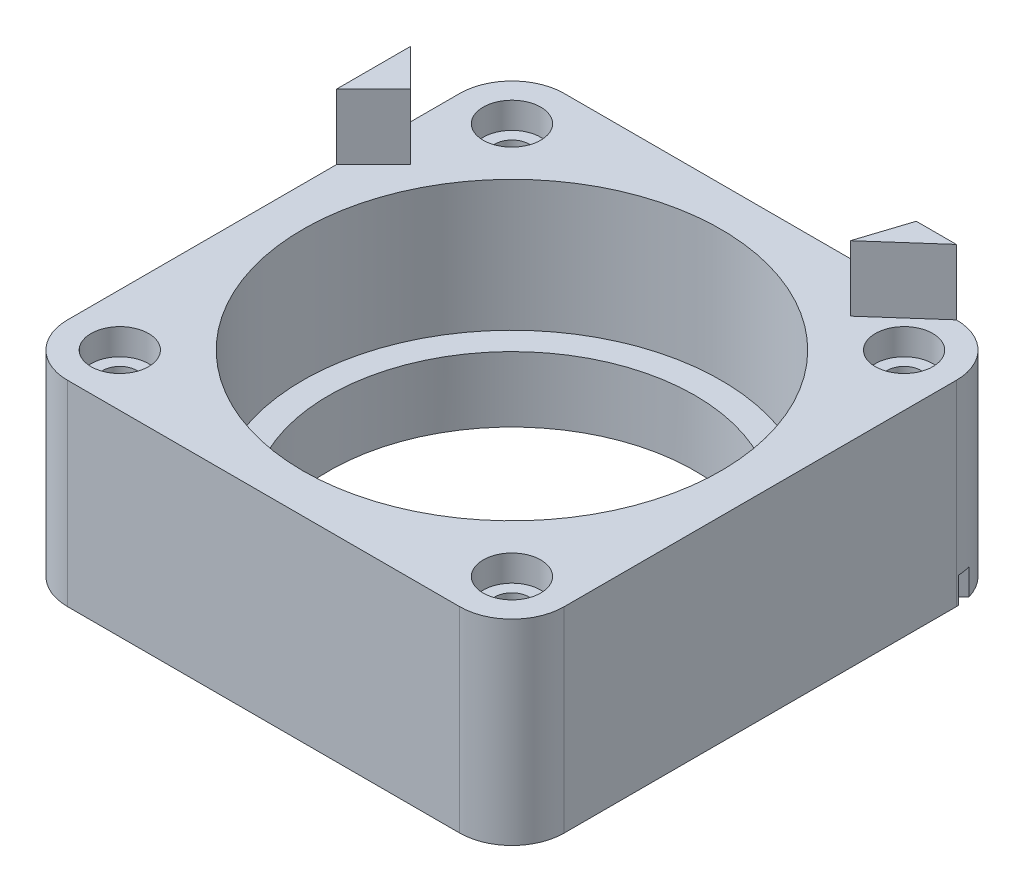
ISO-10303-21;
HEADER;
FILE_DESCRIPTION(('STEP AP214'),'2;1');
FILE_NAME('part.step','',(''),(''),'','','');
FILE_SCHEMA(('AUTOMOTIVE_DESIGN { 1 0 10303 214 1 1 1 1 }'));
ENDSEC;
DATA;
#1=APPLICATION_CONTEXT('core data for automotive mechanical design processes');
#2=APPLICATION_PROTOCOL_DEFINITION('international standard','automotive_design',2000,#1);
#3=PRODUCT_CONTEXT('',#1,'mechanical');
#4=PRODUCT('Part','Part','',(#3));
#5=PRODUCT_RELATED_PRODUCT_CATEGORY('part','',(#4));
#6=PRODUCT_DEFINITION_FORMATION('','',#4);
#7=PRODUCT_DEFINITION_CONTEXT('part definition',#1,'design');
#8=PRODUCT_DEFINITION('design','',#6,#7);
#9=PRODUCT_DEFINITION_SHAPE('','',#8);
#10=(LENGTH_UNIT() NAMED_UNIT(*) SI_UNIT(.MILLI.,.METRE.));
#11=(NAMED_UNIT(*) PLANE_ANGLE_UNIT() SI_UNIT($,.RADIAN.));
#12=(NAMED_UNIT(*) SI_UNIT($,.STERADIAN.) SOLID_ANGLE_UNIT());
#13=UNCERTAINTY_MEASURE_WITH_UNIT(LENGTH_MEASURE(1.E-05),#10,'distance_accuracy_value','');
#14=(GEOMETRIC_REPRESENTATION_CONTEXT(3) GLOBAL_UNCERTAINTY_ASSIGNED_CONTEXT((#13)) GLOBAL_UNIT_ASSIGNED_CONTEXT((#10,
#11,#12)) REPRESENTATION_CONTEXT('',''));
#15=CARTESIAN_POINT('',(0.,0.,0.));
#16=DIRECTION('',(0.,0.,1.));
#17=DIRECTION('',(1.,0.,0.));
#18=AXIS2_PLACEMENT_3D('',#15,#16,#17);
#19=CARTESIAN_POINT('',(0.,15.,0.));
#20=DIRECTION('',(0.,1.,0.));
#21=DIRECTION('',(0.,0.,1.));
#22=AXIS2_PLACEMENT_3D('',#19,#20,#21);
#23=PLANE('',#22);
#24=CARTESIAN_POINT('',(-15.,15.,-15.));
#25=DIRECTION('',(0.,1.,0.));
#26=DIRECTION('',(0.,0.,1.));
#27=AXIS2_PLACEMENT_3D('',#24,#25,#26);
#28=CIRCLE('',#27,2.2);
#29=CARTESIAN_POINT('',(-15.,15.,-12.8));
#30=VERTEX_POINT('',#29);
#31=EDGE_CURVE('E216',#30,#30,#28,.T.);
#32=ORIENTED_EDGE('',*,*,#31,.F.);
#33=EDGE_LOOP('',(#32));
#34=FACE_BOUND('',#33,.T.);
#35=CARTESIAN_POINT('',(15.,15.,-15.));
#36=DIRECTION('',(0.,1.,0.));
#37=DIRECTION('',(0.,0.,1.));
#38=AXIS2_PLACEMENT_3D('',#35,#36,#37);
#39=CIRCLE('',#38,2.2);
#40=CARTESIAN_POINT('',(15.,15.,-12.8));
#41=VERTEX_POINT('',#40);
#42=EDGE_CURVE('E228',#41,#41,#39,.T.);
#43=ORIENTED_EDGE('',*,*,#42,.F.);
#44=EDGE_LOOP('',(#43));
#45=FACE_BOUND('',#44,.T.);
#46=CARTESIAN_POINT('',(-15.,15.,15.));
#47=DIRECTION('',(0.,1.,0.));
#48=DIRECTION('',(0.,0.,1.));
#49=AXIS2_PLACEMENT_3D('',#46,#47,#48);
#50=CIRCLE('',#49,2.2);
#51=CARTESIAN_POINT('',(-15.,15.,17.2));
#52=VERTEX_POINT('',#51);
#53=EDGE_CURVE('E240',#52,#52,#50,.T.);
#54=ORIENTED_EDGE('',*,*,#53,.F.);
#55=EDGE_LOOP('',(#54));
#56=FACE_BOUND('',#55,.T.);
#57=CARTESIAN_POINT('',(15.,15.,15.));
#58=DIRECTION('',(0.,1.,0.));
#59=DIRECTION('',(0.,0.,1.));
#60=AXIS2_PLACEMENT_3D('',#57,#58,#59);
#61=CIRCLE('',#60,2.2);
#62=CARTESIAN_POINT('',(15.,15.,17.2));
#63=VERTEX_POINT('',#62);
#64=EDGE_CURVE('E252',#63,#63,#61,.T.);
#65=ORIENTED_EDGE('',*,*,#64,.F.);
#66=EDGE_LOOP('',(#65));
#67=FACE_BOUND('',#66,.T.);
#68=CARTESIAN_POINT('',(0.,15.,0.));
#69=DIRECTION('',(0.,1.,0.));
#70=DIRECTION('',(0.,0.,1.));
#71=AXIS2_PLACEMENT_3D('',#68,#69,#70);
#72=CIRCLE('',#71,16.);
#73=CARTESIAN_POINT('',(0.,15.,16.));
#74=VERTEX_POINT('',#73);
#75=EDGE_CURVE('E272',#74,#74,#72,.T.);
#76=ORIENTED_EDGE('',*,*,#75,.F.);
#77=EDGE_LOOP('',(#76));
#78=FACE_BOUND('',#77,.T.);
#79=DIRECTION('',(0.748815360939308,0.,-0.662778662315961));
#80=VECTOR('',#79,1.);
#81=CARTESIAN_POINT('',(10.7004792307012,15.,-15.194481613597));
#82=LINE('',#81,#80);
#83=CARTESIAN_POINT('',(10.7004792307012,15.,-15.194481613597));
#84=VERTEX_POINT('',#83);
#85=CARTESIAN_POINT('',(15.,15.,-19.));
#86=VERTEX_POINT('',#85);
#87=EDGE_CURVE('E167',#84,#86,#82,.T.);
#88=ORIENTED_EDGE('',*,*,#87,.F.);
#89=DIRECTION('',(-0.308020881064552,0.,0.951379596600756));
#90=VECTOR('',#89,1.);
#91=CARTESIAN_POINT('',(11.9325627549594,15.,-19.));
#92=LINE('',#91,#90);
#93=CARTESIAN_POINT('',(11.9325627549594,15.,-19.));
#94=VERTEX_POINT('',#93);
#95=EDGE_CURVE('E392',#94,#84,#92,.T.);
#96=ORIENTED_EDGE('',*,*,#95,.F.);
#97=DIRECTION('',(-1.,0.,0.));
#98=VECTOR('',#97,1.);
#99=CARTESIAN_POINT('',(19.,15.,-19.));
#100=LINE('',#99,#98);
#101=CARTESIAN_POINT('',(-15.,15.,-19.));
#102=VERTEX_POINT('',#101);
#103=EDGE_CURVE('E173',#94,#102,#100,.T.);
#104=ORIENTED_EDGE('',*,*,#103,.T.);
#105=CARTESIAN_POINT('',(-15.,15.,-15.));
#106=DIRECTION('',(0.,1.,0.));
#107=DIRECTION('',(0.,0.,1.));
#108=AXIS2_PLACEMENT_3D('',#105,#106,#107);
#109=CIRCLE('',#108,4.);
#110=CARTESIAN_POINT('',(-19.,15.,-15.));
#111=VERTEX_POINT('',#110);
#112=EDGE_CURVE('E321',#102,#111,#109,.T.);
#113=ORIENTED_EDGE('',*,*,#112,.T.);
#114=DIRECTION('',(0.,0.,1.));
#115=VECTOR('',#114,1.);
#116=CARTESIAN_POINT('',(-19.,15.,-19.));
#117=LINE('',#116,#115);
#118=CARTESIAN_POINT('',(-19.,15.,-11.2218254069478));
#119=VERTEX_POINT('',#118);
#120=EDGE_CURVE('E281',#111,#119,#117,.T.);
#121=ORIENTED_EDGE('',*,*,#120,.T.);
#122=DIRECTION('',(-0.707106781186551,0.,-0.707106781186545));
#123=VECTOR('',#122,1.);
#124=CARTESIAN_POINT('',(-19.,15.,-11.2218254069478));
#125=LINE('',#124,#123);
#126=CARTESIAN_POINT('',(-16.1715728752538,15.,-8.39339828220164));
#127=VERTEX_POINT('',#126);
#128=EDGE_CURVE('E175',#127,#119,#125,.T.);
#129=ORIENTED_EDGE('',*,*,#128,.F.);
#130=DIRECTION('',(0.707106781186544,0.,-0.707106781186551));
#131=VECTOR('',#130,1.);
#132=CARTESIAN_POINT('',(-16.1715728752538,15.,-8.39339828220164));
#133=LINE('',#132,#131);
#134=CARTESIAN_POINT('',(-19.,15.,-5.56497115745542));
#135=VERTEX_POINT('',#134);
#136=EDGE_CURVE('E55',#135,#127,#133,.T.);
#137=ORIENTED_EDGE('',*,*,#136,.F.);
#138=CARTESIAN_POINT('',(-19.,15.,15.));
#139=VERTEX_POINT('',#138);
#140=EDGE_CURVE('E280',#135,#139,#117,.T.);
#141=ORIENTED_EDGE('',*,*,#140,.T.);
#142=CARTESIAN_POINT('',(-15.,15.,15.));
#143=DIRECTION('',(0.,1.,0.));
#144=DIRECTION('',(0.,0.,1.));
#145=AXIS2_PLACEMENT_3D('',#142,#143,#144);
#146=CIRCLE('',#145,4.);
#147=CARTESIAN_POINT('',(-15.,15.,19.));
#148=VERTEX_POINT('',#147);
#149=EDGE_CURVE('E325',#139,#148,#146,.T.);
#150=ORIENTED_EDGE('',*,*,#149,.T.);
#151=DIRECTION('',(1.,0.,0.));
#152=VECTOR('',#151,1.);
#153=CARTESIAN_POINT('',(-19.,15.,19.));
#154=LINE('',#153,#152);
#155=CARTESIAN_POINT('',(15.,15.,19.));
#156=VERTEX_POINT('',#155);
#157=EDGE_CURVE('E283',#148,#156,#154,.T.);
#158=ORIENTED_EDGE('',*,*,#157,.T.);
#159=CARTESIAN_POINT('',(15.,15.,15.));
#160=DIRECTION('',(0.,1.,0.));
#161=DIRECTION('',(0.,0.,1.));
#162=AXIS2_PLACEMENT_3D('',#159,#160,#161);
#163=CIRCLE('',#162,4.);
#164=CARTESIAN_POINT('',(19.,15.,15.));
#165=VERTEX_POINT('',#164);
#166=EDGE_CURVE('E323',#156,#165,#163,.T.);
#167=ORIENTED_EDGE('',*,*,#166,.T.);
#168=DIRECTION('',(0.,0.,-1.));
#169=VECTOR('',#168,1.);
#170=CARTESIAN_POINT('',(19.,15.,19.));
#171=LINE('',#170,#169);
#172=CARTESIAN_POINT('',(19.,15.,-15.));
#173=VERTEX_POINT('',#172);
#174=EDGE_CURVE('E275',#165,#173,#171,.T.);
#175=ORIENTED_EDGE('',*,*,#174,.T.);
#176=CARTESIAN_POINT('',(15.,15.,-15.));
#177=DIRECTION('',(0.,1.,0.));
#178=DIRECTION('',(0.,0.,1.));
#179=AXIS2_PLACEMENT_3D('',#176,#177,#178);
#180=CIRCLE('',#179,4.);
#181=EDGE_CURVE('E318',#173,#86,#180,.T.);
#182=ORIENTED_EDGE('',*,*,#181,.T.);
#183=EDGE_LOOP('',(#88,#96,#104,#113,#121,#129,#137,#141,#150,#158,#167,#175,#182));
#184=FACE_BOUND('',#183,.T.);
#185=ADVANCED_FACE('F32',(#34,#45,#56,#67,#78,#184),#23,.T.);
#186=CARTESIAN_POINT('',(19.,15.,19.));
#187=DIRECTION('',(-1.,0.,0.));
#188=DIRECTION('',(0.,0.,1.));
#189=AXIS2_PLACEMENT_3D('',#186,#187,#188);
#190=PLANE('',#189);
#191=ORIENTED_EDGE('',*,*,#174,.F.);
#192=DIRECTION('',(0.,-1.,0.));
#193=VECTOR('',#192,1.);
#194=CARTESIAN_POINT('',(19.,15.,15.));
#195=LINE('',#194,#193);
#196=CARTESIAN_POINT('',(19.,0.,15.));
#197=VERTEX_POINT('',#196);
#198=EDGE_CURVE('E329',#165,#197,#195,.T.);
#199=ORIENTED_EDGE('',*,*,#198,.T.);
#200=DIRECTION('',(0.,0.,-1.));
#201=VECTOR('',#200,1.);
#202=CARTESIAN_POINT('',(19.,0.,19.));
#203=LINE('',#202,#201);
#204=CARTESIAN_POINT('',(19.,0.,-15.));
#205=VERTEX_POINT('',#204);
#206=EDGE_CURVE('E271',#197,#205,#203,.T.);
#207=ORIENTED_EDGE('',*,*,#206,.T.);
#208=DIRECTION('',(0.,-1.,0.));
#209=VECTOR('',#208,1.);
#210=CARTESIAN_POINT('',(19.,15.,-15.));
#211=LINE('',#210,#209);
#212=EDGE_CURVE('E327',#205,#173,#211,.F.);
#213=ORIENTED_EDGE('',*,*,#212,.T.);
#214=EDGE_LOOP('',(#191,#199,#207,#213));
#215=FACE_BOUND('',#214,.T.);
#216=ADVANCED_FACE('F368',(#215),#190,.F.);
#217=CARTESIAN_POINT('',(19.,15.,-19.));
#218=DIRECTION('',(0.,0.,1.));
#219=DIRECTION('',(1.,0.,0.));
#220=AXIS2_PLACEMENT_3D('',#217,#218,#219);
#221=PLANE('',#220);
#222=DIRECTION('',(-1.,0.,0.));
#223=VECTOR('',#222,1.);
#224=CARTESIAN_POINT('',(19.,0.,-19.));
#225=LINE('',#224,#223);
#226=CARTESIAN_POINT('',(15.,0.,-19.));
#227=VERTEX_POINT('',#226);
#228=CARTESIAN_POINT('',(-15.,0.,-19.));
#229=VERTEX_POINT('',#228);
#230=EDGE_CURVE('E289',#227,#229,#225,.T.);
#231=ORIENTED_EDGE('',*,*,#230,.T.);
#232=DIRECTION('',(0.,-1.,0.));
#233=VECTOR('',#232,1.);
#234=CARTESIAN_POINT('',(-15.,15.,-19.));
#235=LINE('',#234,#233);
#236=EDGE_CURVE('E335',#229,#102,#235,.F.);
#237=ORIENTED_EDGE('',*,*,#236,.T.);
#238=ORIENTED_EDGE('',*,*,#103,.F.);
#239=DIRECTION('',(0.,-1.,0.));
#240=VECTOR('',#239,1.);
#241=CARTESIAN_POINT('',(11.9325627549594,20.,-19.));
#242=LINE('',#241,#240);
#243=CARTESIAN_POINT('',(11.9325627549594,20.,-19.));
#244=VERTEX_POINT('',#243);
#245=EDGE_CURVE('E156',#244,#94,#242,.T.);
#246=ORIENTED_EDGE('',*,*,#245,.F.);
#247=DIRECTION('',(-1.,0.,0.));
#248=VECTOR('',#247,1.);
#249=CARTESIAN_POINT('',(15.,20.,-19.));
#250=LINE('',#249,#248);
#251=CARTESIAN_POINT('',(15.,20.,-19.));
#252=VERTEX_POINT('',#251);
#253=EDGE_CURVE('E160',#252,#244,#250,.T.);
#254=ORIENTED_EDGE('',*,*,#253,.F.);
#255=DIRECTION('',(0.,-1.,0.));
#256=VECTOR('',#255,1.);
#257=CARTESIAN_POINT('',(15.,20.,-19.));
#258=LINE('',#257,#256);
#259=EDGE_CURVE('E177',#252,#86,#258,.T.);
#260=ORIENTED_EDGE('',*,*,#259,.T.);
#261=DIRECTION('',(0.,-1.,0.));
#262=VECTOR('',#261,1.);
#263=CARTESIAN_POINT('',(15.,15.,-19.));
#264=LINE('',#263,#262);
#265=EDGE_CURVE('E332',#86,#227,#264,.T.);
#266=ORIENTED_EDGE('',*,*,#265,.T.);
#267=EDGE_LOOP('',(#231,#237,#238,#246,#254,#260,#266));
#268=FACE_BOUND('',#267,.T.);
#269=ADVANCED_FACE('F171',(#268),#221,.F.);
#270=CARTESIAN_POINT('',(-19.,15.,-19.));
#271=DIRECTION('',(1.,0.,0.));
#272=DIRECTION('',(0.,0.,-1.));
#273=AXIS2_PLACEMENT_3D('',#270,#271,#272);
#274=PLANE('',#273);
#275=DIRECTION('',(0.,0.,1.));
#276=VECTOR('',#275,1.);
#277=CARTESIAN_POINT('',(-19.,0.,-19.));
#278=LINE('',#277,#276);
#279=CARTESIAN_POINT('',(-19.,0.,-15.));
#280=VERTEX_POINT('',#279);
#281=CARTESIAN_POINT('',(-19.,0.,15.));
#282=VERTEX_POINT('',#281);
#283=EDGE_CURVE('E291',#280,#282,#278,.T.);
#284=ORIENTED_EDGE('',*,*,#283,.T.);
#285=DIRECTION('',(0.,-1.,0.));
#286=VECTOR('',#285,1.);
#287=CARTESIAN_POINT('',(-19.,15.,15.));
#288=LINE('',#287,#286);
#289=EDGE_CURVE('E315',#282,#139,#288,.F.);
#290=ORIENTED_EDGE('',*,*,#289,.T.);
#291=ORIENTED_EDGE('',*,*,#140,.F.);
#292=DIRECTION('',(0.,-1.,0.));
#293=VECTOR('',#292,1.);
#294=CARTESIAN_POINT('',(-19.,20.,-5.56497115745541));
#295=LINE('',#294,#293);
#296=CARTESIAN_POINT('',(-19.,20.,-5.56497115745541));
#297=VERTEX_POINT('',#296);
#298=EDGE_CURVE('E196',#297,#135,#295,.T.);
#299=ORIENTED_EDGE('',*,*,#298,.F.);
#300=DIRECTION('',(0.,0.,1.));
#301=VECTOR('',#300,1.);
#302=CARTESIAN_POINT('',(-19.,20.,-5.56497115745541));
#303=LINE('',#302,#301);
#304=CARTESIAN_POINT('',(-19.,20.,-11.2218254069478));
#305=VERTEX_POINT('',#304);
#306=EDGE_CURVE('E181',#305,#297,#303,.T.);
#307=ORIENTED_EDGE('',*,*,#306,.F.);
#308=DIRECTION('',(0.,-1.,0.));
#309=VECTOR('',#308,1.);
#310=CARTESIAN_POINT('',(-19.,20.,-11.2218254069478));
#311=LINE('',#310,#309);
#312=EDGE_CURVE('E187',#305,#119,#311,.T.);
#313=ORIENTED_EDGE('',*,*,#312,.T.);
#314=ORIENTED_EDGE('',*,*,#120,.F.);
#315=DIRECTION('',(0.,-1.,0.));
#316=VECTOR('',#315,1.);
#317=CARTESIAN_POINT('',(-19.,15.,-15.));
#318=LINE('',#317,#316);
#319=EDGE_CURVE('E312',#111,#280,#318,.T.);
#320=ORIENTED_EDGE('',*,*,#319,.T.);
#321=EDGE_LOOP('',(#284,#290,#291,#299,#307,#313,#314,#320));
#322=FACE_BOUND('',#321,.T.);
#323=ADVANCED_FACE('F386',(#322),#274,.F.);
#324=CARTESIAN_POINT('',(-19.,15.,19.));
#325=DIRECTION('',(0.,0.,-1.));
#326=DIRECTION('',(-1.,0.,0.));
#327=AXIS2_PLACEMENT_3D('',#324,#325,#326);
#328=PLANE('',#327);
#329=ORIENTED_EDGE('',*,*,#157,.F.);
#330=DIRECTION('',(0.,-1.,0.));
#331=VECTOR('',#330,1.);
#332=CARTESIAN_POINT('',(-15.,15.,19.));
#333=LINE('',#332,#331);
#334=CARTESIAN_POINT('',(-15.,0.,19.));
#335=VERTEX_POINT('',#334);
#336=EDGE_CURVE('E299',#148,#335,#333,.T.);
#337=ORIENTED_EDGE('',*,*,#336,.T.);
#338=DIRECTION('',(1.,0.,0.));
#339=VECTOR('',#338,1.);
#340=CARTESIAN_POINT('',(-19.,0.,19.));
#341=LINE('',#340,#339);
#342=CARTESIAN_POINT('',(15.,0.,19.));
#343=VERTEX_POINT('',#342);
#344=EDGE_CURVE('E278',#335,#343,#341,.T.);
#345=ORIENTED_EDGE('',*,*,#344,.T.);
#346=DIRECTION('',(0.,-1.,0.));
#347=VECTOR('',#346,1.);
#348=CARTESIAN_POINT('',(15.,15.,19.));
#349=LINE('',#348,#347);
#350=EDGE_CURVE('E286',#343,#156,#349,.F.);
#351=ORIENTED_EDGE('',*,*,#350,.T.);
#352=EDGE_LOOP('',(#329,#337,#345,#351));
#353=FACE_BOUND('',#352,.T.);
#354=ADVANCED_FACE('F376',(#353),#328,.F.);
#355=CARTESIAN_POINT('',(0.,0.,0.));
#356=DIRECTION('',(0.,1.,0.));
#357=DIRECTION('',(0.,0.,1.));
#358=AXIS2_PLACEMENT_3D('',#355,#356,#357);
#359=PLANE('',#358);
#360=CARTESIAN_POINT('',(-15.,0.,-15.));
#361=DIRECTION('',(0.,1.,0.));
#362=DIRECTION('',(0.,0.,1.));
#363=AXIS2_PLACEMENT_3D('',#360,#361,#362);
#364=CIRCLE('',#363,1.3);
#365=CARTESIAN_POINT('',(-15.,0.,-13.7));
#366=VERTEX_POINT('',#365);
#367=EDGE_CURVE('E225',#366,#366,#364,.T.);
#368=ORIENTED_EDGE('',*,*,#367,.T.);
#369=EDGE_LOOP('',(#368));
#370=FACE_BOUND('',#369,.T.);
#371=CARTESIAN_POINT('',(15.,0.,-15.));
#372=DIRECTION('',(0.,1.,0.));
#373=DIRECTION('',(0.,0.,1.));
#374=AXIS2_PLACEMENT_3D('',#371,#372,#373);
#375=CIRCLE('',#374,1.3);
#376=CARTESIAN_POINT('',(15.,0.,-13.7));
#377=VERTEX_POINT('',#376);
#378=EDGE_CURVE('E237',#377,#377,#375,.T.);
#379=ORIENTED_EDGE('',*,*,#378,.T.);
#380=EDGE_LOOP('',(#379));
#381=FACE_BOUND('',#380,.T.);
#382=CARTESIAN_POINT('',(-15.,0.,15.));
#383=DIRECTION('',(0.,1.,0.));
#384=DIRECTION('',(0.,0.,1.));
#385=AXIS2_PLACEMENT_3D('',#382,#383,#384);
#386=CIRCLE('',#385,1.3);
#387=CARTESIAN_POINT('',(-15.,0.,16.3));
#388=VERTEX_POINT('',#387);
#389=EDGE_CURVE('E249',#388,#388,#386,.T.);
#390=ORIENTED_EDGE('',*,*,#389,.T.);
#391=EDGE_LOOP('',(#390));
#392=FACE_BOUND('',#391,.T.);
#393=CARTESIAN_POINT('',(15.,0.,15.));
#394=DIRECTION('',(0.,1.,0.));
#395=DIRECTION('',(0.,0.,1.));
#396=AXIS2_PLACEMENT_3D('',#393,#394,#395);
#397=CIRCLE('',#396,1.3);
#398=CARTESIAN_POINT('',(15.,0.,16.3));
#399=VERTEX_POINT('',#398);
#400=EDGE_CURVE('E261',#399,#399,#397,.T.);
#401=ORIENTED_EDGE('',*,*,#400,.T.);
#402=EDGE_LOOP('',(#401));
#403=FACE_BOUND('',#402,.T.);
#404=CARTESIAN_POINT('',(0.,0.,0.));
#405=DIRECTION('',(0.,1.,0.));
#406=DIRECTION('',(0.,0.,1.));
#407=AXIS2_PLACEMENT_3D('',#404,#405,#406);
#408=CIRCLE('',#407,14.);
#409=CARTESIAN_POINT('',(11.1826366805141,0.,-8.42310138082289));
#410=VERTEX_POINT('',#409);
#411=CARTESIAN_POINT('',(11.6498013210211,0.,-7.76415669475661));
#412=VERTEX_POINT('',#411);
#413=EDGE_CURVE('E264',#410,#412,#408,.T.);
#414=ORIENTED_EDGE('',*,*,#413,.T.);
#415=DIRECTION('',(-0.705141787682873,0.,0.709066329241068));
#416=VECTOR('',#415,1.);
#417=CARTESIAN_POINT('',(0.481017186760843,0.,3.46678849456391));
#418=LINE('',#417,#416);
#419=CARTESIAN_POINT('',(18.9970978092417,0.,-15.1523453424152));
#420=VERTEX_POINT('',#419);
#421=EDGE_CURVE('E199',#420,#412,#418,.T.);
#422=ORIENTED_EDGE('',*,*,#421,.F.);
#423=CARTESIAN_POINT('',(15.,0.,-15.));
#424=DIRECTION('',(0.,1.,0.));
#425=DIRECTION('',(0.,0.,1.));
#426=AXIS2_PLACEMENT_3D('',#423,#424,#425);
#427=CIRCLE('',#426,4.);
#428=EDGE_CURVE('E302',#420,#205,#427,.F.);
#429=ORIENTED_EDGE('',*,*,#428,.T.);
#430=ORIENTED_EDGE('',*,*,#206,.F.);
#431=CARTESIAN_POINT('',(15.,0.,15.));
#432=DIRECTION('',(0.,1.,0.));
#433=DIRECTION('',(0.,0.,1.));
#434=AXIS2_PLACEMENT_3D('',#431,#432,#433);
#435=CIRCLE('',#434,4.);
#436=EDGE_CURVE('E308',#197,#343,#435,.F.);
#437=ORIENTED_EDGE('',*,*,#436,.T.);
#438=ORIENTED_EDGE('',*,*,#344,.F.);
#439=CARTESIAN_POINT('',(-15.,0.,15.));
#440=DIRECTION('',(0.,1.,0.));
#441=DIRECTION('',(0.,0.,1.));
#442=AXIS2_PLACEMENT_3D('',#439,#440,#441);
#443=CIRCLE('',#442,4.);
#444=EDGE_CURVE('E310',#335,#282,#443,.F.);
#445=ORIENTED_EDGE('',*,*,#444,.T.);
#446=ORIENTED_EDGE('',*,*,#283,.F.);
#447=CARTESIAN_POINT('',(-15.,0.,-15.));
#448=DIRECTION('',(0.,1.,0.));
#449=DIRECTION('',(0.,0.,1.));
#450=AXIS2_PLACEMENT_3D('',#447,#448,#449);
#451=CIRCLE('',#450,4.);
#452=EDGE_CURVE('E306',#280,#229,#451,.F.);
#453=ORIENTED_EDGE('',*,*,#452,.T.);
#454=ORIENTED_EDGE('',*,*,#230,.F.);
#455=CARTESIAN_POINT('',(18.8393041891464,0.,-16.1223828861858));
#456=VERTEX_POINT('',#455);
#457=EDGE_CURVE('E303',#227,#456,#427,.F.);
#458=ORIENTED_EDGE('',*,*,#457,.T.);
#459=DIRECTION('',(0.705141787682873,0.,-0.709066329241068));
#460=VECTOR('',#459,1.);
#461=CARTESIAN_POINT('',(19.,0.,-16.2839730666526));
#462=LINE('',#461,#460);
#463=EDGE_CURVE('E204',#410,#456,#462,.T.);
#464=ORIENTED_EDGE('',*,*,#463,.F.);
#465=EDGE_LOOP('',(#414,#422,#429,#430,#437,#438,#445,#446,#453,#454,#458,#464));
#466=FACE_BOUND('',#465,.T.);
#467=ADVANCED_FACE('F359',(#370,#381,#392,#403,#466),#359,.F.);
#468=CARTESIAN_POINT('',(0.,5.,0.));
#469=DIRECTION('',(0.,1.,0.));
#470=DIRECTION('',(0.,0.,1.));
#471=AXIS2_PLACEMENT_3D('',#468,#469,#470);
#472=CYLINDRICAL_SURFACE('',#471,16.);
#473=CARTESIAN_POINT('',(0.,5.,0.));
#474=DIRECTION('',(0.,1.,0.));
#475=DIRECTION('',(0.,0.,1.));
#476=AXIS2_PLACEMENT_3D('',#473,#474,#475);
#477=CIRCLE('',#476,16.);
#478=CARTESIAN_POINT('',(0.,5.,16.));
#479=VERTEX_POINT('',#478);
#480=EDGE_CURVE('E268',#479,#479,#477,.T.);
#481=ORIENTED_EDGE('',*,*,#480,.F.);
#482=EDGE_LOOP('',(#481));
#483=FACE_BOUND('',#482,.T.);
#484=ORIENTED_EDGE('',*,*,#75,.T.);
#485=EDGE_LOOP('',(#484));
#486=FACE_BOUND('',#485,.T.);
#487=ADVANCED_FACE('F417',(#483,#486),#472,.F.);
#488=CARTESIAN_POINT('',(0.,5.,0.));
#489=DIRECTION('',(0.,1.,0.));
#490=DIRECTION('',(0.,0.,1.));
#491=AXIS2_PLACEMENT_3D('',#488,#489,#490);
#492=PLANE('',#491);
#493=CARTESIAN_POINT('',(0.,5.,0.));
#494=DIRECTION('',(0.,1.,0.));
#495=DIRECTION('',(0.,0.,1.));
#496=AXIS2_PLACEMENT_3D('',#493,#494,#495);
#497=CIRCLE('',#496,14.);
#498=CARTESIAN_POINT('',(0.,5.,14.));
#499=VERTEX_POINT('',#498);
#500=EDGE_CURVE('E267',#499,#499,#497,.T.);
#501=ORIENTED_EDGE('',*,*,#500,.F.);
#502=EDGE_LOOP('',(#501));
#503=FACE_BOUND('',#502,.T.);
#504=ORIENTED_EDGE('',*,*,#480,.T.);
#505=EDGE_LOOP('',(#504));
#506=FACE_BOUND('',#505,.T.);
#507=ADVANCED_FACE('F453',(#503,#506),#492,.T.);
#508=CARTESIAN_POINT('',(0.,0.,0.));
#509=DIRECTION('',(0.,1.,0.));
#510=DIRECTION('',(0.,0.,1.));
#511=AXIS2_PLACEMENT_3D('',#508,#509,#510);
#512=CYLINDRICAL_SURFACE('',#511,14.);
#513=ORIENTED_EDGE('',*,*,#500,.T.);
#514=EDGE_LOOP('',(#513));
#515=FACE_BOUND('',#514,.T.);
#516=CARTESIAN_POINT('',(0.,2.,0.));
#517=DIRECTION('',(0.,-1.,0.));
#518=DIRECTION('',(0.,0.,-1.));
#519=AXIS2_PLACEMENT_3D('',#516,#517,#518);
#520=CIRCLE('',#519,14.);
#521=CARTESIAN_POINT('',(11.6498013210211,2.,-7.76415669475661));
#522=VERTEX_POINT('',#521);
#523=CARTESIAN_POINT('',(11.1826366805141,2.,-8.42310138082289));
#524=VERTEX_POINT('',#523);
#525=EDGE_CURVE('E206',#522,#524,#520,.F.);
#526=ORIENTED_EDGE('',*,*,#525,.F.);
#527=DIRECTION('',(0.,1.,0.));
#528=VECTOR('',#527,1.);
#529=CARTESIAN_POINT('',(11.6498013210211,0.,-7.76415669475661));
#530=LINE('',#529,#528);
#531=EDGE_CURVE('E213',#522,#412,#530,.F.);
#532=ORIENTED_EDGE('',*,*,#531,.T.);
#533=ORIENTED_EDGE('',*,*,#413,.F.);
#534=DIRECTION('',(0.,1.,0.));
#535=VECTOR('',#534,1.);
#536=CARTESIAN_POINT('',(11.1826366805141,0.,-8.42310138082289));
#537=LINE('',#536,#535);
#538=EDGE_CURVE('E210',#410,#524,#537,.T.);
#539=ORIENTED_EDGE('',*,*,#538,.T.);
#540=EDGE_LOOP('',(#526,#532,#533,#539));
#541=FACE_BOUND('',#540,.T.);
#542=ADVANCED_FACE('F357',(#515,#541),#512,.F.);
#543=CARTESIAN_POINT('',(-15.,15.,15.));
#544=DIRECTION('',(0.,-1.,0.));
#545=DIRECTION('',(0.,0.,-1.));
#546=AXIS2_PLACEMENT_3D('',#543,#544,#545);
#547=CYLINDRICAL_SURFACE('',#546,4.);
#548=ORIENTED_EDGE('',*,*,#149,.F.);
#549=ORIENTED_EDGE('',*,*,#289,.F.);
#550=ORIENTED_EDGE('',*,*,#444,.F.);
#551=ORIENTED_EDGE('',*,*,#336,.F.);
#552=EDGE_LOOP('',(#548,#549,#550,#551));
#553=FACE_BOUND('',#552,.T.);
#554=ADVANCED_FACE('F382',(#553),#547,.T.);
#555=CARTESIAN_POINT('',(15.,15.,15.));
#556=DIRECTION('',(0.,-1.,0.));
#557=DIRECTION('',(0.,0.,-1.));
#558=AXIS2_PLACEMENT_3D('',#555,#556,#557);
#559=CYLINDRICAL_SURFACE('',#558,4.);
#560=ORIENTED_EDGE('',*,*,#166,.F.);
#561=ORIENTED_EDGE('',*,*,#350,.F.);
#562=ORIENTED_EDGE('',*,*,#436,.F.);
#563=ORIENTED_EDGE('',*,*,#198,.F.);
#564=EDGE_LOOP('',(#560,#561,#562,#563));
#565=FACE_BOUND('',#564,.T.);
#566=ADVANCED_FACE('F379',(#565),#559,.T.);
#567=CARTESIAN_POINT('',(-15.,15.,-15.));
#568=DIRECTION('',(0.,-1.,0.));
#569=DIRECTION('',(0.,0.,-1.));
#570=AXIS2_PLACEMENT_3D('',#567,#568,#569);
#571=CYLINDRICAL_SURFACE('',#570,4.);
#572=ORIENTED_EDGE('',*,*,#112,.F.);
#573=ORIENTED_EDGE('',*,*,#236,.F.);
#574=ORIENTED_EDGE('',*,*,#452,.F.);
#575=ORIENTED_EDGE('',*,*,#319,.F.);
#576=EDGE_LOOP('',(#572,#573,#574,#575));
#577=FACE_BOUND('',#576,.T.);
#578=ADVANCED_FACE('F391',(#577),#571,.T.);
#579=CARTESIAN_POINT('',(15.,15.,-15.));
#580=DIRECTION('',(0.,-1.,0.));
#581=DIRECTION('',(0.,0.,-1.));
#582=AXIS2_PLACEMENT_3D('',#579,#580,#581);
#583=CYLINDRICAL_SURFACE('',#582,4.);
#584=DIRECTION('',(0.,-1.,0.));
#585=VECTOR('',#584,1.);
#586=CARTESIAN_POINT('',(18.9970978092417,15.,-15.1523453424152));
#587=LINE('',#586,#585);
#588=CARTESIAN_POINT('',(18.9970978092417,2.,-15.1523453424152));
#589=VERTEX_POINT('',#588);
#590=EDGE_CURVE('E11',#589,#420,#587,.T.);
#591=ORIENTED_EDGE('',*,*,#590,.F.);
#592=CARTESIAN_POINT('',(15.,2.,-15.));
#593=DIRECTION('',(0.,-1.,0.));
#594=DIRECTION('',(0.,0.,-1.));
#595=AXIS2_PLACEMENT_3D('',#592,#593,#594);
#596=CIRCLE('',#595,4.);
#597=CARTESIAN_POINT('',(18.8393041891464,2.,-16.1223828861858));
#598=VERTEX_POINT('',#597);
#599=EDGE_CURVE('E337',#589,#598,#596,.F.);
#600=ORIENTED_EDGE('',*,*,#599,.T.);
#601=DIRECTION('',(0.,-1.,0.));
#602=VECTOR('',#601,1.);
#603=CARTESIAN_POINT('',(18.8393041891464,15.,-16.1223828861858));
#604=LINE('',#603,#602);
#605=EDGE_CURVE('E40',#456,#598,#604,.F.);
#606=ORIENTED_EDGE('',*,*,#605,.F.);
#607=ORIENTED_EDGE('',*,*,#457,.F.);
#608=ORIENTED_EDGE('',*,*,#265,.F.);
#609=ORIENTED_EDGE('',*,*,#181,.F.);
#610=ORIENTED_EDGE('',*,*,#212,.F.);
#611=ORIENTED_EDGE('',*,*,#428,.F.);
#612=EDGE_LOOP('',(#591,#600,#606,#607,#608,#609,#610,#611));
#613=FACE_BOUND('',#612,.T.);
#614=ADVANCED_FACE('F34',(#613),#583,.T.);
#615=CARTESIAN_POINT('',(15.,15.,15.));
#616=DIRECTION('',(0.,1.,0.));
#617=DIRECTION('',(0.,0.,1.));
#618=AXIS2_PLACEMENT_3D('',#615,#616,#617);
#619=CYLINDRICAL_SURFACE('',#618,1.3);
#620=ORIENTED_EDGE('',*,*,#400,.F.);
#621=EDGE_LOOP('',(#620));
#622=FACE_BOUND('',#621,.T.);
#623=CARTESIAN_POINT('',(15.,13.,15.));
#624=DIRECTION('',(0.,1.,0.));
#625=DIRECTION('',(0.,0.,1.));
#626=AXIS2_PLACEMENT_3D('',#623,#624,#625);
#627=CIRCLE('',#626,1.3);
#628=CARTESIAN_POINT('',(15.,13.,16.3));
#629=VERTEX_POINT('',#628);
#630=EDGE_CURVE('E258',#629,#629,#627,.T.);
#631=ORIENTED_EDGE('',*,*,#630,.T.);
#632=EDGE_LOOP('',(#631));
#633=FACE_BOUND('',#632,.T.);
#634=ADVANCED_FACE('F435',(#622,#633),#619,.F.);
#635=CARTESIAN_POINT('',(16.3,13.,15.));
#636=DIRECTION('',(0.,-1.,0.));
#637=DIRECTION('',(0.,0.,-1.));
#638=AXIS2_PLACEMENT_3D('',#635,#636,#637);
#639=PLANE('',#638);
#640=ORIENTED_EDGE('',*,*,#630,.F.);
#641=EDGE_LOOP('',(#640));
#642=FACE_BOUND('',#641,.T.);
#643=CARTESIAN_POINT('',(15.,13.,15.));
#644=DIRECTION('',(0.,1.,0.));
#645=DIRECTION('',(0.,0.,1.));
#646=AXIS2_PLACEMENT_3D('',#643,#644,#645);
#647=CIRCLE('',#646,2.2);
#648=CARTESIAN_POINT('',(15.,13.,17.2));
#649=VERTEX_POINT('',#648);
#650=EDGE_CURVE('E255',#649,#649,#647,.T.);
#651=ORIENTED_EDGE('',*,*,#650,.T.);
#652=EDGE_LOOP('',(#651));
#653=FACE_BOUND('',#652,.T.);
#654=ADVANCED_FACE('F439',(#642,#653),#639,.F.);
#655=CARTESIAN_POINT('',(15.,15.,15.));
#656=DIRECTION('',(0.,1.,0.));
#657=DIRECTION('',(0.,0.,1.));
#658=AXIS2_PLACEMENT_3D('',#655,#656,#657);
#659=CYLINDRICAL_SURFACE('',#658,2.2);
#660=ORIENTED_EDGE('',*,*,#650,.F.);
#661=EDGE_LOOP('',(#660));
#662=FACE_BOUND('',#661,.T.);
#663=ORIENTED_EDGE('',*,*,#64,.T.);
#664=EDGE_LOOP('',(#663));
#665=FACE_BOUND('',#664,.T.);
#666=ADVANCED_FACE('F445',(#662,#665),#659,.F.);
#667=CARTESIAN_POINT('',(-15.,15.,15.));
#668=DIRECTION('',(0.,1.,0.));
#669=DIRECTION('',(0.,0.,1.));
#670=AXIS2_PLACEMENT_3D('',#667,#668,#669);
#671=CYLINDRICAL_SURFACE('',#670,1.3);
#672=ORIENTED_EDGE('',*,*,#389,.F.);
#673=EDGE_LOOP('',(#672));
#674=FACE_BOUND('',#673,.T.);
#675=CARTESIAN_POINT('',(-15.,13.,15.));
#676=DIRECTION('',(0.,1.,0.));
#677=DIRECTION('',(0.,0.,1.));
#678=AXIS2_PLACEMENT_3D('',#675,#676,#677);
#679=CIRCLE('',#678,1.3);
#680=CARTESIAN_POINT('',(-15.,13.,16.3));
#681=VERTEX_POINT('',#680);
#682=EDGE_CURVE('E246',#681,#681,#679,.T.);
#683=ORIENTED_EDGE('',*,*,#682,.T.);
#684=EDGE_LOOP('',(#683));
#685=FACE_BOUND('',#684,.T.);
#686=ADVANCED_FACE('F541',(#674,#685),#671,.F.);
#687=CARTESIAN_POINT('',(-13.7,13.,15.));
#688=DIRECTION('',(0.,-1.,0.));
#689=DIRECTION('',(0.,0.,-1.));
#690=AXIS2_PLACEMENT_3D('',#687,#688,#689);
#691=PLANE('',#690);
#692=ORIENTED_EDGE('',*,*,#682,.F.);
#693=EDGE_LOOP('',(#692));
#694=FACE_BOUND('',#693,.T.);
#695=CARTESIAN_POINT('',(-15.,13.,15.));
#696=DIRECTION('',(0.,1.,0.));
#697=DIRECTION('',(0.,0.,1.));
#698=AXIS2_PLACEMENT_3D('',#695,#696,#697);
#699=CIRCLE('',#698,2.2);
#700=CARTESIAN_POINT('',(-15.,13.,17.2));
#701=VERTEX_POINT('',#700);
#702=EDGE_CURVE('E243',#701,#701,#699,.T.);
#703=ORIENTED_EDGE('',*,*,#702,.T.);
#704=EDGE_LOOP('',(#703));
#705=FACE_BOUND('',#704,.T.);
#706=ADVANCED_FACE('F549',(#694,#705),#691,.F.);
#707=CARTESIAN_POINT('',(-15.,15.,15.));
#708=DIRECTION('',(0.,1.,0.));
#709=DIRECTION('',(0.,0.,1.));
#710=AXIS2_PLACEMENT_3D('',#707,#708,#709);
#711=CYLINDRICAL_SURFACE('',#710,2.2);
#712=ORIENTED_EDGE('',*,*,#702,.F.);
#713=EDGE_LOOP('',(#712));
#714=FACE_BOUND('',#713,.T.);
#715=ORIENTED_EDGE('',*,*,#53,.T.);
#716=EDGE_LOOP('',(#715));
#717=FACE_BOUND('',#716,.T.);
#718=ADVANCED_FACE('F558',(#714,#717),#711,.F.);
#719=CARTESIAN_POINT('',(15.,15.,-15.));
#720=DIRECTION('',(0.,1.,0.));
#721=DIRECTION('',(0.,0.,1.));
#722=AXIS2_PLACEMENT_3D('',#719,#720,#721);
#723=CYLINDRICAL_SURFACE('',#722,1.3);
#724=ORIENTED_EDGE('',*,*,#378,.F.);
#725=EDGE_LOOP('',(#724));
#726=FACE_BOUND('',#725,.T.);
#727=CARTESIAN_POINT('',(15.,13.,-15.));
#728=DIRECTION('',(0.,1.,0.));
#729=DIRECTION('',(0.,0.,1.));
#730=AXIS2_PLACEMENT_3D('',#727,#728,#729);
#731=CIRCLE('',#730,1.3);
#732=CARTESIAN_POINT('',(15.,13.,-13.7));
#733=VERTEX_POINT('',#732);
#734=EDGE_CURVE('E234',#733,#733,#731,.T.);
#735=ORIENTED_EDGE('',*,*,#734,.T.);
#736=EDGE_LOOP('',(#735));
#737=FACE_BOUND('',#736,.T.);
#738=ADVANCED_FACE('F567',(#726,#737),#723,.F.);
#739=CARTESIAN_POINT('',(16.3,13.,-15.));
#740=DIRECTION('',(0.,-1.,0.));
#741=DIRECTION('',(0.,0.,-1.));
#742=AXIS2_PLACEMENT_3D('',#739,#740,#741);
#743=PLANE('',#742);
#744=ORIENTED_EDGE('',*,*,#734,.F.);
#745=EDGE_LOOP('',(#744));
#746=FACE_BOUND('',#745,.T.);
#747=CARTESIAN_POINT('',(15.,13.,-15.));
#748=DIRECTION('',(0.,1.,0.));
#749=DIRECTION('',(0.,0.,1.));
#750=AXIS2_PLACEMENT_3D('',#747,#748,#749);
#751=CIRCLE('',#750,2.2);
#752=CARTESIAN_POINT('',(15.,13.,-12.8));
#753=VERTEX_POINT('',#752);
#754=EDGE_CURVE('E231',#753,#753,#751,.T.);
#755=ORIENTED_EDGE('',*,*,#754,.T.);
#756=EDGE_LOOP('',(#755));
#757=FACE_BOUND('',#756,.T.);
#758=ADVANCED_FACE('F576',(#746,#757),#743,.F.);
#759=CARTESIAN_POINT('',(15.,15.,-15.));
#760=DIRECTION('',(0.,1.,0.));
#761=DIRECTION('',(0.,0.,1.));
#762=AXIS2_PLACEMENT_3D('',#759,#760,#761);
#763=CYLINDRICAL_SURFACE('',#762,2.2);
#764=ORIENTED_EDGE('',*,*,#754,.F.);
#765=EDGE_LOOP('',(#764));
#766=FACE_BOUND('',#765,.T.);
#767=ORIENTED_EDGE('',*,*,#42,.T.);
#768=EDGE_LOOP('',(#767));
#769=FACE_BOUND('',#768,.T.);
#770=ADVANCED_FACE('F585',(#766,#769),#763,.F.);
#771=CARTESIAN_POINT('',(-15.,15.,-15.));
#772=DIRECTION('',(0.,1.,0.));
#773=DIRECTION('',(0.,0.,1.));
#774=AXIS2_PLACEMENT_3D('',#771,#772,#773);
#775=CYLINDRICAL_SURFACE('',#774,1.3);
#776=ORIENTED_EDGE('',*,*,#367,.F.);
#777=EDGE_LOOP('',(#776));
#778=FACE_BOUND('',#777,.T.);
#779=CARTESIAN_POINT('',(-15.,13.,-15.));
#780=DIRECTION('',(0.,1.,0.));
#781=DIRECTION('',(0.,0.,1.));
#782=AXIS2_PLACEMENT_3D('',#779,#780,#781);
#783=CIRCLE('',#782,1.3);
#784=CARTESIAN_POINT('',(-15.,13.,-13.7));
#785=VERTEX_POINT('',#784);
#786=EDGE_CURVE('E222',#785,#785,#783,.T.);
#787=ORIENTED_EDGE('',*,*,#786,.T.);
#788=EDGE_LOOP('',(#787));
#789=FACE_BOUND('',#788,.T.);
#790=ADVANCED_FACE('F594',(#778,#789),#775,.F.);
#791=CARTESIAN_POINT('',(-13.7,13.,-15.));
#792=DIRECTION('',(0.,-1.,0.));
#793=DIRECTION('',(0.,0.,-1.));
#794=AXIS2_PLACEMENT_3D('',#791,#792,#793);
#795=PLANE('',#794);
#796=ORIENTED_EDGE('',*,*,#786,.F.);
#797=EDGE_LOOP('',(#796));
#798=FACE_BOUND('',#797,.T.);
#799=CARTESIAN_POINT('',(-15.,13.,-15.));
#800=DIRECTION('',(0.,1.,0.));
#801=DIRECTION('',(0.,0.,1.));
#802=AXIS2_PLACEMENT_3D('',#799,#800,#801);
#803=CIRCLE('',#802,2.2);
#804=CARTESIAN_POINT('',(-15.,13.,-12.8));
#805=VERTEX_POINT('',#804);
#806=EDGE_CURVE('E219',#805,#805,#803,.T.);
#807=ORIENTED_EDGE('',*,*,#806,.T.);
#808=EDGE_LOOP('',(#807));
#809=FACE_BOUND('',#808,.T.);
#810=ADVANCED_FACE('F603',(#798,#809),#795,.F.);
#811=CARTESIAN_POINT('',(-15.,15.,-15.));
#812=DIRECTION('',(0.,1.,0.));
#813=DIRECTION('',(0.,0.,1.));
#814=AXIS2_PLACEMENT_3D('',#811,#812,#813);
#815=CYLINDRICAL_SURFACE('',#814,2.2);
#816=ORIENTED_EDGE('',*,*,#806,.F.);
#817=EDGE_LOOP('',(#816));
#818=FACE_BOUND('',#817,.T.);
#819=ORIENTED_EDGE('',*,*,#31,.T.);
#820=EDGE_LOOP('',(#819));
#821=FACE_BOUND('',#820,.T.);
#822=ADVANCED_FACE('F612',(#818,#821),#815,.F.);
#823=CARTESIAN_POINT('',(0.481017186760843,2.,3.46678849456391));
#824=DIRECTION('',(0.709066329241068,0.,0.705141787682873));
#825=DIRECTION('',(0.705141787682873,0.,-0.709066329241068));
#826=AXIS2_PLACEMENT_3D('',#823,#824,#825);
#827=PLANE('',#826);
#828=DIRECTION('',(-0.705141787682873,0.,0.709066329241068));
#829=VECTOR('',#828,1.);
#830=CARTESIAN_POINT('',(0.481017186760843,2.,3.46678849456391));
#831=LINE('',#830,#829);
#832=EDGE_CURVE('E200',#589,#522,#831,.T.);
#833=ORIENTED_EDGE('',*,*,#832,.F.);
#834=ORIENTED_EDGE('',*,*,#590,.T.);
#835=ORIENTED_EDGE('',*,*,#421,.T.);
#836=ORIENTED_EDGE('',*,*,#531,.F.);
#837=EDGE_LOOP('',(#833,#834,#835,#836));
#838=FACE_BOUND('',#837,.T.);
#839=ADVANCED_FACE('F353',(#838),#827,.F.);
#840=CARTESIAN_POINT('',(19.,2.,-16.2839730666526));
#841=DIRECTION('',(-0.709066329241068,0.,-0.705141787682873));
#842=DIRECTION('',(-0.705141787682873,0.,0.709066329241068));
#843=AXIS2_PLACEMENT_3D('',#840,#841,#842);
#844=PLANE('',#843);
#845=ORIENTED_EDGE('',*,*,#463,.T.);
#846=ORIENTED_EDGE('',*,*,#605,.T.);
#847=DIRECTION('',(0.705141787682873,0.,-0.709066329241068));
#848=VECTOR('',#847,1.);
#849=CARTESIAN_POINT('',(19.,2.,-16.2839730666526));
#850=LINE('',#849,#848);
#851=EDGE_CURVE('E203',#524,#598,#850,.T.);
#852=ORIENTED_EDGE('',*,*,#851,.F.);
#853=ORIENTED_EDGE('',*,*,#538,.F.);
#854=EDGE_LOOP('',(#845,#846,#852,#853));
#855=FACE_BOUND('',#854,.T.);
#856=ADVANCED_FACE('F343',(#855),#844,.F.);
#857=CARTESIAN_POINT('',(0.,2.,0.));
#858=DIRECTION('',(0.,-1.,0.));
#859=DIRECTION('',(0.,0.,-1.));
#860=AXIS2_PLACEMENT_3D('',#857,#858,#859);
#861=PLANE('',#860);
#862=ORIENTED_EDGE('',*,*,#525,.T.);
#863=ORIENTED_EDGE('',*,*,#851,.T.);
#864=ORIENTED_EDGE('',*,*,#599,.F.);
#865=ORIENTED_EDGE('',*,*,#832,.T.);
#866=EDGE_LOOP('',(#862,#863,#864,#865));
#867=FACE_BOUND('',#866,.T.);
#868=ADVANCED_FACE('F350',(#867),#861,.T.);
#869=CARTESIAN_POINT('',(-16.1715728752538,20.,-8.39339828220164));
#870=DIRECTION('',(-0.707106781186551,0.,-0.707106781186544));
#871=DIRECTION('',(-0.707106781186544,0.,0.707106781186551));
#872=AXIS2_PLACEMENT_3D('',#869,#870,#871);
#873=PLANE('',#872);
#874=ORIENTED_EDGE('',*,*,#136,.T.);
#875=DIRECTION('',(0.,-1.,0.));
#876=VECTOR('',#875,1.);
#877=CARTESIAN_POINT('',(-16.1715728752538,20.,-8.39339828220164));
#878=LINE('',#877,#876);
#879=CARTESIAN_POINT('',(-16.1715728752538,20.,-8.39339828220164));
#880=VERTEX_POINT('',#879);
#881=EDGE_CURVE('E193',#880,#127,#878,.T.);
#882=ORIENTED_EDGE('',*,*,#881,.F.);
#883=DIRECTION('',(0.707106781186544,0.,-0.707106781186551));
#884=VECTOR('',#883,1.);
#885=CARTESIAN_POINT('',(-16.1715728752538,20.,-8.39339828220164));
#886=LINE('',#885,#884);
#887=EDGE_CURVE('E184',#297,#880,#886,.T.);
#888=ORIENTED_EDGE('',*,*,#887,.F.);
#889=ORIENTED_EDGE('',*,*,#298,.T.);
#890=EDGE_LOOP('',(#874,#882,#888,#889));
#891=FACE_BOUND('',#890,.T.);
#892=ADVANCED_FACE('F641',(#891),#873,.F.);
#893=CARTESIAN_POINT('',(-19.,20.,-11.2218254069478));
#894=DIRECTION('',(-0.707106781186545,0.,0.707106781186551));
#895=DIRECTION('',(0.707106781186551,0.,0.707106781186545));
#896=AXIS2_PLACEMENT_3D('',#893,#894,#895);
#897=PLANE('',#896);
#898=ORIENTED_EDGE('',*,*,#128,.T.);
#899=ORIENTED_EDGE('',*,*,#312,.F.);
#900=DIRECTION('',(-0.707106781186551,0.,-0.707106781186545));
#901=VECTOR('',#900,1.);
#902=CARTESIAN_POINT('',(-19.,20.,-11.2218254069478));
#903=LINE('',#902,#901);
#904=EDGE_CURVE('E186',#880,#305,#903,.T.);
#905=ORIENTED_EDGE('',*,*,#904,.F.);
#906=ORIENTED_EDGE('',*,*,#881,.T.);
#907=EDGE_LOOP('',(#898,#899,#905,#906));
#908=FACE_BOUND('',#907,.T.);
#909=ADVANCED_FACE('F661',(#908),#897,.F.);
#910=CARTESIAN_POINT('',(0.,20.,0.));
#911=DIRECTION('',(0.,-1.,0.));
#912=DIRECTION('',(0.,0.,-1.));
#913=AXIS2_PLACEMENT_3D('',#910,#911,#912);
#914=PLANE('',#913);
#915=ORIENTED_EDGE('',*,*,#306,.T.);
#916=ORIENTED_EDGE('',*,*,#887,.T.);
#917=ORIENTED_EDGE('',*,*,#904,.T.);
#918=EDGE_LOOP('',(#915,#916,#917));
#919=FACE_BOUND('',#918,.T.);
#920=ADVANCED_FACE('F404',(#919),#914,.F.);
#921=CARTESIAN_POINT('',(11.9325627549594,20.,-19.));
#922=DIRECTION('',(0.951379596600756,0.,0.308020881064552));
#923=DIRECTION('',(0.308020881064552,0.,-0.951379596600756));
#924=AXIS2_PLACEMENT_3D('',#921,#922,#923);
#925=PLANE('',#924);
#926=ORIENTED_EDGE('',*,*,#95,.T.);
#927=DIRECTION('',(0.,-1.,0.));
#928=VECTOR('',#927,1.);
#929=CARTESIAN_POINT('',(10.7004792307012,20.,-15.194481613597));
#930=LINE('',#929,#928);
#931=CARTESIAN_POINT('',(10.7004792307012,20.,-15.194481613597));
#932=VERTEX_POINT('',#931);
#933=EDGE_CURVE('E47',#932,#84,#930,.T.);
#934=ORIENTED_EDGE('',*,*,#933,.F.);
#935=DIRECTION('',(-0.308020881064552,0.,0.951379596600756));
#936=VECTOR('',#935,1.);
#937=CARTESIAN_POINT('',(11.9325627549594,20.,-19.));
#938=LINE('',#937,#936);
#939=EDGE_CURVE('E152',#244,#932,#938,.T.);
#940=ORIENTED_EDGE('',*,*,#939,.F.);
#941=ORIENTED_EDGE('',*,*,#245,.T.);
#942=EDGE_LOOP('',(#926,#934,#940,#941));
#943=FACE_BOUND('',#942,.T.);
#944=ADVANCED_FACE('F154',(#943),#925,.F.);
#945=CARTESIAN_POINT('',(10.7004792307012,20.,-15.194481613597));
#946=DIRECTION('',(-0.662778662315961,0.,-0.748815360939308));
#947=DIRECTION('',(-0.748815360939308,0.,0.662778662315961));
#948=AXIS2_PLACEMENT_3D('',#945,#946,#947);
#949=PLANE('',#948);
#950=ORIENTED_EDGE('',*,*,#87,.T.);
#951=ORIENTED_EDGE('',*,*,#259,.F.);
#952=DIRECTION('',(0.748815360939308,0.,-0.662778662315961));
#953=VECTOR('',#952,1.);
#954=CARTESIAN_POINT('',(10.7004792307012,20.,-15.194481613597));
#955=LINE('',#954,#953);
#956=EDGE_CURVE('E159',#932,#252,#955,.T.);
#957=ORIENTED_EDGE('',*,*,#956,.F.);
#958=ORIENTED_EDGE('',*,*,#933,.T.);
#959=EDGE_LOOP('',(#950,#951,#957,#958));
#960=FACE_BOUND('',#959,.T.);
#961=ADVANCED_FACE('F396',(#960),#949,.F.);
#962=CARTESIAN_POINT('',(0.,20.,0.));
#963=DIRECTION('',(0.,1.,0.));
#964=DIRECTION('',(0.,0.,1.));
#965=AXIS2_PLACEMENT_3D('',#962,#963,#964);
#966=PLANE('',#965);
#967=ORIENTED_EDGE('',*,*,#253,.T.);
#968=ORIENTED_EDGE('',*,*,#939,.T.);
#969=ORIENTED_EDGE('',*,*,#956,.T.);
#970=EDGE_LOOP('',(#967,#968,#969));
#971=FACE_BOUND('',#970,.T.);
#972=ADVANCED_FACE('F163',(#971),#966,.T.);
#973=CLOSED_SHELL('',(#185,#216,#269,#323,#354,#467,#487,#507,#542,#554,#566,#578,#614,#634,
#654,#666,#686,#706,#718,#738,#758,#770,#790,#810,#822,#839,#856,#868,#892,#909,#920,#944,#961,#972));
#974=MANIFOLD_SOLID_BREP('B2',#973);
#975=ADVANCED_BREP_SHAPE_REPRESENTATION('',(#18,#974),#14);
#976=SHAPE_DEFINITION_REPRESENTATION(#9,#975);
ENDSEC;
END-ISO-10303-21;
